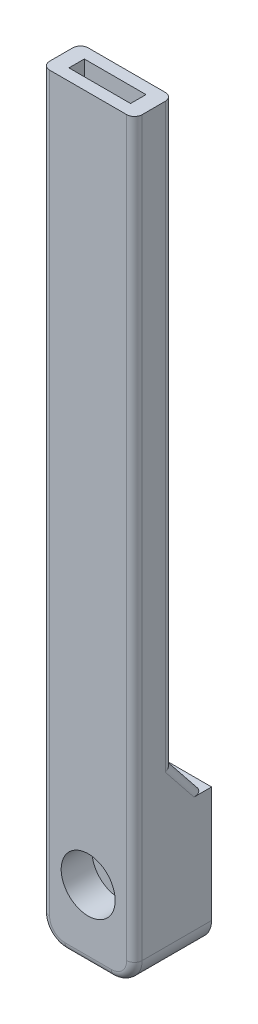
ISO-10303-21;
HEADER;
FILE_DESCRIPTION(('STEP AP214'),'2;1');
FILE_NAME('part.step','',(''),(''),'','','');
FILE_SCHEMA(('AUTOMOTIVE_DESIGN { 1 0 10303 214 1 1 1 1 }'));
ENDSEC;
DATA;
#1=APPLICATION_CONTEXT('core data for automotive mechanical design processes');
#2=APPLICATION_PROTOCOL_DEFINITION('international standard','automotive_design',2000,#1);
#3=PRODUCT_CONTEXT('',#1,'mechanical');
#4=PRODUCT('Part','Part','',(#3));
#5=PRODUCT_RELATED_PRODUCT_CATEGORY('part','',(#4));
#6=PRODUCT_DEFINITION_FORMATION('','',#4);
#7=PRODUCT_DEFINITION_CONTEXT('part definition',#1,'design');
#8=PRODUCT_DEFINITION('design','',#6,#7);
#9=PRODUCT_DEFINITION_SHAPE('','',#8);
#10=(LENGTH_UNIT() NAMED_UNIT(*) SI_UNIT(.MILLI.,.METRE.));
#11=(NAMED_UNIT(*) PLANE_ANGLE_UNIT() SI_UNIT($,.RADIAN.));
#12=(NAMED_UNIT(*) SI_UNIT($,.STERADIAN.) SOLID_ANGLE_UNIT());
#13=UNCERTAINTY_MEASURE_WITH_UNIT(LENGTH_MEASURE(1.E-05),#10,'distance_accuracy_value','');
#14=(GEOMETRIC_REPRESENTATION_CONTEXT(3) GLOBAL_UNCERTAINTY_ASSIGNED_CONTEXT((#13)) GLOBAL_UNIT_ASSIGNED_CONTEXT((#10,
#11,#12)) REPRESENTATION_CONTEXT('',''));
#15=CARTESIAN_POINT('',(0.,0.,0.));
#16=DIRECTION('',(0.,0.,1.));
#17=DIRECTION('',(1.,0.,0.));
#18=AXIS2_PLACEMENT_3D('',#15,#16,#17);
#19=CARTESIAN_POINT('',(0.,0.,23.000000026077));
#20=DIRECTION('',(0.,0.,-1.));
#21=DIRECTION('',(-1.,0.,0.));
#22=AXIS2_PLACEMENT_3D('',#19,#20,#21);
#23=CYLINDRICAL_SURFACE('',#22,2.);
#24=CARTESIAN_POINT('',(0.,0.,3.00000002607703));
#25=DIRECTION('',(0.,0.,-1.));
#26=DIRECTION('',(-1.,0.,0.));
#27=AXIS2_PLACEMENT_3D('',#24,#25,#26);
#28=CIRCLE('',#27,2.);
#29=CARTESIAN_POINT('',(-2.,0.,3.00000002607703));
#30=VERTEX_POINT('',#29);
#31=EDGE_CURVE('E269',#30,#30,#28,.T.);
#32=ORIENTED_EDGE('',*,*,#31,.T.);
#33=EDGE_LOOP('',(#32));
#34=FACE_BOUND('',#33,.T.);
#35=CARTESIAN_POINT('',(0.,0.,9.00000002607703));
#36=DIRECTION('',(0.,0.,1.));
#37=DIRECTION('',(1.,0.,0.));
#38=AXIS2_PLACEMENT_3D('',#35,#36,#37);
#39=CIRCLE('',#38,2.);
#40=CARTESIAN_POINT('',(2.,0.,9.00000002607703));
#41=VERTEX_POINT('',#40);
#42=EDGE_CURVE('E44',#41,#41,#39,.T.);
#43=ORIENTED_EDGE('',*,*,#42,.T.);
#44=EDGE_LOOP('',(#43));
#45=FACE_BOUND('',#44,.T.);
#46=ADVANCED_FACE('F40',(#34,#45),#23,.F.);
#47=CARTESIAN_POINT('',(-6.,9.,13.000000026077));
#48=DIRECTION('',(0.,-1.,0.));
#49=DIRECTION('',(0.,0.,-1.));
#50=AXIS2_PLACEMENT_3D('',#47,#48,#49);
#51=PLANE('',#50);
#52=DIRECTION('',(0.,0.,-1.));
#53=VECTOR('',#52,1.);
#54=CARTESIAN_POINT('',(-6.,9.,13.000000026077));
#55=LINE('',#54,#53);
#56=CARTESIAN_POINT('',(-6.,9.,5.2806248735636));
#57=VERTEX_POINT('',#56);
#58=CARTESIAN_POINT('',(-6.,9.,3.00000002607703));
#59=VERTEX_POINT('',#58);
#60=EDGE_CURVE('E58',#57,#59,#55,.T.);
#61=ORIENTED_EDGE('',*,*,#60,.F.);
#62=CARTESIAN_POINT('',(-5.,9.,5.2806248735636));
#63=DIRECTION('',(0.,-1.,0.));
#64=DIRECTION('',(0.,0.,1.));
#65=AXIS2_PLACEMENT_3D('',#62,#63,#64);
#66=ELLIPSE('',#65,1.28062484748657,1.);
#67=CARTESIAN_POINT('',(-5.,9.,4.00000002607703));
#68=VERTEX_POINT('',#67);
#69=EDGE_CURVE('E50',#57,#68,#66,.T.);
#70=ORIENTED_EDGE('',*,*,#69,.T.);
#71=DIRECTION('',(-1.,0.,0.));
#72=VECTOR('',#71,1.);
#73=CARTESIAN_POINT('',(6.,9.,4.00000002607703));
#74=LINE('',#73,#72);
#75=CARTESIAN_POINT('',(5.,9.,4.00000002607703));
#76=VERTEX_POINT('',#75);
#77=EDGE_CURVE('E366',#76,#68,#74,.T.);
#78=ORIENTED_EDGE('',*,*,#77,.F.);
#79=CARTESIAN_POINT('',(5.,9.,5.2806248735636));
#80=DIRECTION('',(0.,-1.,0.));
#81=DIRECTION('',(0.,0.,1.));
#82=AXIS2_PLACEMENT_3D('',#79,#80,#81);
#83=ELLIPSE('',#82,1.28062484748657,1.);
#84=CARTESIAN_POINT('',(6.,9.,5.2806248735636));
#85=VERTEX_POINT('',#84);
#86=EDGE_CURVE('E295',#76,#85,#83,.T.);
#87=ORIENTED_EDGE('',*,*,#86,.T.);
#88=DIRECTION('',(0.,0.,-1.));
#89=VECTOR('',#88,1.);
#90=CARTESIAN_POINT('',(6.,9.,13.000000026077));
#91=LINE('',#90,#89);
#92=CARTESIAN_POINT('',(6.,9.,3.00000002607703));
#93=VERTEX_POINT('',#92);
#94=EDGE_CURVE('E392',#85,#93,#91,.T.);
#95=ORIENTED_EDGE('',*,*,#94,.T.);
#96=DIRECTION('',(1.,0.,0.));
#97=VECTOR('',#96,1.);
#98=CARTESIAN_POINT('',(0.,9.,3.00000002607703));
#99=LINE('',#98,#97);
#100=EDGE_CURVE('E396',#59,#93,#99,.T.);
#101=ORIENTED_EDGE('',*,*,#100,.F.);
#102=EDGE_LOOP('',(#61,#70,#78,#87,#95,#101));
#103=FACE_BOUND('',#102,.T.);
#104=ADVANCED_FACE('F440',(#103),#51,.F.);
#105=CARTESIAN_POINT('',(-6.,9.,13.000000026077));
#106=DIRECTION('',(1.,0.,0.));
#107=DIRECTION('',(0.,1.,0.));
#108=AXIS2_PLACEMENT_3D('',#105,#106,#107);
#109=PLANE('',#108);
#110=DIRECTION('',(0.,-0.78086880944303,-0.624695047554424));
#111=VECTOR('',#110,1.);
#112=CARTESIAN_POINT('',(-6.,8.37530495244558,4.78086883552006));
#113=LINE('',#112,#111);
#114=CARTESIAN_POINT('',(-6.,13.6492189406418,9.00000002607703));
#115=VERTEX_POINT('',#114);
#116=EDGE_CURVE('E292',#115,#57,#113,.T.);
#117=ORIENTED_EDGE('',*,*,#116,.T.);
#118=ORIENTED_EDGE('',*,*,#60,.T.);
#119=DIRECTION('',(0.,-1.,0.));
#120=VECTOR('',#119,1.);
#121=CARTESIAN_POINT('',(-6.,9.,3.00000002607703));
#122=LINE('',#121,#120);
#123=CARTESIAN_POINT('',(-6.,-6.,3.00000002607703));
#124=VERTEX_POINT('',#123);
#125=EDGE_CURVE('E178',#59,#124,#122,.T.);
#126=ORIENTED_EDGE('',*,*,#125,.T.);
#127=DIRECTION('',(0.,0.,-1.));
#128=VECTOR('',#127,1.);
#129=CARTESIAN_POINT('',(-6.,-6.,13.000000026077));
#130=LINE('',#129,#128);
#131=CARTESIAN_POINT('',(-6.,-6.,12.000000026077));
#132=VERTEX_POINT('',#131);
#133=EDGE_CURVE('E191',#124,#132,#130,.F.);
#134=ORIENTED_EDGE('',*,*,#133,.T.);
#135=DIRECTION('',(0.,-1.,0.));
#136=VECTOR('',#135,1.);
#137=CARTESIAN_POINT('',(-6.00000000000001,89.,12.000000026077));
#138=LINE('',#137,#136);
#139=CARTESIAN_POINT('',(-6.,89.,12.000000026077));
#140=VERTEX_POINT('',#139);
#141=EDGE_CURVE('E253',#132,#140,#138,.F.);
#142=ORIENTED_EDGE('',*,*,#141,.T.);
#143=DIRECTION('',(0.,0.,1.));
#144=VECTOR('',#143,1.);
#145=CARTESIAN_POINT('',(-6.,89.,13.000000026077));
#146=LINE('',#145,#144);
#147=CARTESIAN_POINT('',(-6.,89.,9.00000002607703));
#148=VERTEX_POINT('',#147);
#149=EDGE_CURVE('E370',#148,#140,#146,.T.);
#150=ORIENTED_EDGE('',*,*,#149,.F.);
#151=DIRECTION('',(0.,-1.,0.));
#152=VECTOR('',#151,1.);
#153=CARTESIAN_POINT('',(-6.,9.,9.00000002607703));
#154=LINE('',#153,#152);
#155=EDGE_CURVE('E66',#148,#115,#154,.T.);
#156=ORIENTED_EDGE('',*,*,#155,.T.);
#157=EDGE_LOOP('',(#117,#118,#126,#134,#142,#150,#156));
#158=FACE_BOUND('',#157,.T.);
#159=ADVANCED_FACE('F190',(#158),#109,.F.);
#160=CARTESIAN_POINT('',(-6.,-9.,13.000000026077));
#161=DIRECTION('',(0.,1.,0.));
#162=DIRECTION('',(0.,0.,1.));
#163=AXIS2_PLACEMENT_3D('',#160,#161,#162);
#164=PLANE('',#163);
#165=DIRECTION('',(0.,0.,-1.));
#166=VECTOR('',#165,1.);
#167=CARTESIAN_POINT('',(3.,-9.,13.000000026077));
#168=LINE('',#167,#166);
#169=CARTESIAN_POINT('',(3.,-9.,3.00000002607703));
#170=VERTEX_POINT('',#169);
#171=CARTESIAN_POINT('',(3.,-9.,12.000000026077));
#172=VERTEX_POINT('',#171);
#173=EDGE_CURVE('E200',#170,#172,#168,.F.);
#174=ORIENTED_EDGE('',*,*,#173,.T.);
#175=DIRECTION('',(1.,0.,0.));
#176=VECTOR('',#175,1.);
#177=CARTESIAN_POINT('',(-3.,-9.,12.000000026077));
#178=LINE('',#177,#176);
#179=CARTESIAN_POINT('',(-3.,-9.,12.000000026077));
#180=VERTEX_POINT('',#179);
#181=EDGE_CURVE('E246',#172,#180,#178,.F.);
#182=ORIENTED_EDGE('',*,*,#181,.T.);
#183=DIRECTION('',(0.,0.,-1.));
#184=VECTOR('',#183,1.);
#185=CARTESIAN_POINT('',(-3.,-9.,13.000000026077));
#186=LINE('',#185,#184);
#187=CARTESIAN_POINT('',(-3.,-9.,3.00000002607703));
#188=VERTEX_POINT('',#187);
#189=EDGE_CURVE('E206',#180,#188,#186,.T.);
#190=ORIENTED_EDGE('',*,*,#189,.T.);
#191=DIRECTION('',(1.,0.,0.));
#192=VECTOR('',#191,1.);
#193=CARTESIAN_POINT('',(-6.,-9.,3.00000002607703));
#194=LINE('',#193,#192);
#195=EDGE_CURVE('E180',#188,#170,#194,.T.);
#196=ORIENTED_EDGE('',*,*,#195,.T.);
#197=EDGE_LOOP('',(#174,#182,#190,#196));
#198=FACE_BOUND('',#197,.T.);
#199=ADVANCED_FACE('F407',(#198),#164,.F.);
#200=CARTESIAN_POINT('',(6.,9.,13.000000026077));
#201=DIRECTION('',(-1.,0.,0.));
#202=DIRECTION('',(0.,-1.,0.));
#203=AXIS2_PLACEMENT_3D('',#200,#201,#202);
#204=PLANE('',#203);
#205=ORIENTED_EDGE('',*,*,#94,.F.);
#206=DIRECTION('',(0.,-0.78086880944303,-0.624695047554424));
#207=VECTOR('',#206,1.);
#208=CARTESIAN_POINT('',(6.,14.6253049524456,9.78086883552006));
#209=LINE('',#208,#207);
#210=CARTESIAN_POINT('',(6.,13.6492189406418,9.00000002607703));
#211=VERTEX_POINT('',#210);
#212=EDGE_CURVE('E288',#85,#211,#209,.F.);
#213=ORIENTED_EDGE('',*,*,#212,.T.);
#214=DIRECTION('',(0.,-1.,0.));
#215=VECTOR('',#214,1.);
#216=CARTESIAN_POINT('',(6.,9.,9.00000002607703));
#217=LINE('',#216,#215);
#218=CARTESIAN_POINT('',(6.,89.,9.00000002607703));
#219=VERTEX_POINT('',#218);
#220=EDGE_CURVE('E237',#211,#219,#217,.F.);
#221=ORIENTED_EDGE('',*,*,#220,.T.);
#222=DIRECTION('',(0.,0.,-1.));
#223=VECTOR('',#222,1.);
#224=CARTESIAN_POINT('',(6.,89.,13.000000026077));
#225=LINE('',#224,#223);
#226=CARTESIAN_POINT('',(6.,89.,12.000000026077));
#227=VERTEX_POINT('',#226);
#228=EDGE_CURVE('E381',#227,#219,#225,.T.);
#229=ORIENTED_EDGE('',*,*,#228,.F.);
#230=DIRECTION('',(0.,1.,0.));
#231=VECTOR('',#230,1.);
#232=CARTESIAN_POINT('',(6.,-6.,12.000000026077));
#233=LINE('',#232,#231);
#234=CARTESIAN_POINT('',(6.,-6.,12.000000026077));
#235=VERTEX_POINT('',#234);
#236=EDGE_CURVE('E240',#227,#235,#233,.F.);
#237=ORIENTED_EDGE('',*,*,#236,.T.);
#238=DIRECTION('',(0.,0.,-1.));
#239=VECTOR('',#238,1.);
#240=CARTESIAN_POINT('',(6.,-6.,13.000000026077));
#241=LINE('',#240,#239);
#242=CARTESIAN_POINT('',(6.,-6.,3.00000002607703));
#243=VERTEX_POINT('',#242);
#244=EDGE_CURVE('E402',#235,#243,#241,.T.);
#245=ORIENTED_EDGE('',*,*,#244,.T.);
#246=DIRECTION('',(0.,-1.,0.));
#247=VECTOR('',#246,1.);
#248=CARTESIAN_POINT('',(6.,0.,3.00000002607703));
#249=LINE('',#248,#247);
#250=EDGE_CURVE('E399',#93,#243,#249,.T.);
#251=ORIENTED_EDGE('',*,*,#250,.F.);
#252=EDGE_LOOP('',(#205,#213,#221,#229,#237,#245,#251));
#253=FACE_BOUND('',#252,.T.);
#254=ADVANCED_FACE('F451',(#253),#204,.F.);
#255=CARTESIAN_POINT('',(0.,0.,13.000000026077));
#256=DIRECTION('',(0.,0.,1.));
#257=DIRECTION('',(1.,0.,0.));
#258=AXIS2_PLACEMENT_3D('',#255,#256,#257);
#259=PLANE('',#258);
#260=CARTESIAN_POINT('',(0.,0.,13.000000026077));
#261=DIRECTION('',(0.,0.,1.));
#262=DIRECTION('',(1.,0.,0.));
#263=AXIS2_PLACEMENT_3D('',#260,#261,#262);
#264=CIRCLE('',#263,3.5);
#265=CARTESIAN_POINT('',(3.5,0.,13.000000026077));
#266=VERTEX_POINT('',#265);
#267=EDGE_CURVE('E314',#266,#266,#264,.T.);
#268=ORIENTED_EDGE('',*,*,#267,.F.);
#269=EDGE_LOOP('',(#268));
#270=FACE_BOUND('',#269,.T.);
#271=CARTESIAN_POINT('',(3.,-6.,13.000000026077));
#272=DIRECTION('',(0.,0.,1.));
#273=DIRECTION('',(1.,0.,0.));
#274=AXIS2_PLACEMENT_3D('',#271,#272,#273);
#275=CIRCLE('',#274,2.);
#276=CARTESIAN_POINT('',(3.,-8.,13.000000026077));
#277=VERTEX_POINT('',#276);
#278=CARTESIAN_POINT('',(5.,-6.,13.000000026077));
#279=VERTEX_POINT('',#278);
#280=EDGE_CURVE('E218',#277,#279,#275,.T.);
#281=ORIENTED_EDGE('',*,*,#280,.T.);
#282=DIRECTION('',(0.,1.,0.));
#283=VECTOR('',#282,1.);
#284=CARTESIAN_POINT('',(5.,89.,13.000000026077));
#285=LINE('',#284,#283);
#286=CARTESIAN_POINT('',(5.,89.,13.000000026077));
#287=VERTEX_POINT('',#286);
#288=EDGE_CURVE('E221',#279,#287,#285,.T.);
#289=ORIENTED_EDGE('',*,*,#288,.T.);
#290=DIRECTION('',(1.,0.,0.));
#291=VECTOR('',#290,1.);
#292=CARTESIAN_POINT('',(-6.,89.,13.000000026077));
#293=LINE('',#292,#291);
#294=CARTESIAN_POINT('',(-5.00000000000001,89.,13.000000026077));
#295=VERTEX_POINT('',#294);
#296=EDGE_CURVE('E377',#295,#287,#293,.T.);
#297=ORIENTED_EDGE('',*,*,#296,.F.);
#298=DIRECTION('',(0.,-1.,0.));
#299=VECTOR('',#298,1.);
#300=CARTESIAN_POINT('',(-5.,-6.,13.000000026077));
#301=LINE('',#300,#299);
#302=CARTESIAN_POINT('',(-5.,-6.,13.000000026077));
#303=VERTEX_POINT('',#302);
#304=EDGE_CURVE('E186',#295,#303,#301,.T.);
#305=ORIENTED_EDGE('',*,*,#304,.T.);
#306=CARTESIAN_POINT('',(-3.,-6.,13.000000026077));
#307=DIRECTION('',(0.,0.,1.));
#308=DIRECTION('',(1.,0.,0.));
#309=AXIS2_PLACEMENT_3D('',#306,#307,#308);
#310=CIRCLE('',#309,2.);
#311=CARTESIAN_POINT('',(-3.,-8.,13.000000026077));
#312=VERTEX_POINT('',#311);
#313=EDGE_CURVE('E212',#303,#312,#310,.T.);
#314=ORIENTED_EDGE('',*,*,#313,.T.);
#315=DIRECTION('',(1.,0.,0.));
#316=VECTOR('',#315,1.);
#317=CARTESIAN_POINT('',(3.,-8.,13.000000026077));
#318=LINE('',#317,#316);
#319=EDGE_CURVE('E215',#312,#277,#318,.T.);
#320=ORIENTED_EDGE('',*,*,#319,.T.);
#321=EDGE_LOOP('',(#281,#289,#297,#305,#314,#320));
#322=FACE_BOUND('',#321,.T.);
#323=ADVANCED_FACE('F421',(#270,#322),#259,.T.);
#324=CARTESIAN_POINT('',(-6.,89.,8.00000002607703));
#325=DIRECTION('',(0.,0.,1.));
#326=DIRECTION('',(1.,0.,0.));
#327=AXIS2_PLACEMENT_3D('',#324,#325,#326);
#328=PLANE('',#327);
#329=DIRECTION('',(-1.,0.,0.));
#330=VECTOR('',#329,1.);
#331=CARTESIAN_POINT('',(-6.,89.,8.00000002607703));
#332=LINE('',#331,#330);
#333=CARTESIAN_POINT('',(5.,89.,8.00000002607703));
#334=VERTEX_POINT('',#333);
#335=CARTESIAN_POINT('',(-5.00000000000001,89.,8.00000002607703));
#336=VERTEX_POINT('',#335);
#337=EDGE_CURVE('E194',#334,#336,#332,.T.);
#338=ORIENTED_EDGE('',*,*,#337,.F.);
#339=DIRECTION('',(0.,-1.,0.));
#340=VECTOR('',#339,1.);
#341=CARTESIAN_POINT('',(5.,89.,8.00000002607703));
#342=LINE('',#341,#340);
#343=CARTESIAN_POINT('',(5.,14.,8.00000002607703));
#344=VERTEX_POINT('',#343);
#345=EDGE_CURVE('E259',#334,#344,#342,.T.);
#346=ORIENTED_EDGE('',*,*,#345,.T.);
#347=DIRECTION('',(-1.,0.,0.));
#348=VECTOR('',#347,1.);
#349=CARTESIAN_POINT('',(6.,14.,8.00000002607703));
#350=LINE('',#349,#348);
#351=CARTESIAN_POINT('',(-5.,14.,8.00000002607703));
#352=VERTEX_POINT('',#351);
#353=EDGE_CURVE('E356',#344,#352,#350,.T.);
#354=ORIENTED_EDGE('',*,*,#353,.T.);
#355=DIRECTION('',(0.,-1.,0.));
#356=VECTOR('',#355,1.);
#357=CARTESIAN_POINT('',(-5.00000000000001,89.,8.00000002607703));
#358=LINE('',#357,#356);
#359=EDGE_CURVE('E256',#352,#336,#358,.F.);
#360=ORIENTED_EDGE('',*,*,#359,.T.);
#361=EDGE_LOOP('',(#338,#346,#354,#360));
#362=FACE_BOUND('',#361,.T.);
#363=ADVANCED_FACE('F469',(#362),#328,.F.);
#364=CARTESIAN_POINT('',(0.,89.,0.));
#365=DIRECTION('',(0.,-1.,0.));
#366=DIRECTION('',(0.,0.,-1.));
#367=AXIS2_PLACEMENT_3D('',#364,#365,#366);
#368=PLANE('',#367);
#369=DIRECTION('',(1.,0.,0.));
#370=VECTOR('',#369,1.);
#371=CARTESIAN_POINT('',(-4.,89.,11.500000026077));
#372=LINE('',#371,#370);
#373=CARTESIAN_POINT('',(-4.,89.,11.500000026077));
#374=VERTEX_POINT('',#373);
#375=CARTESIAN_POINT('',(4.,89.,11.500000026077));
#376=VERTEX_POINT('',#375);
#377=EDGE_CURVE('E342',#374,#376,#372,.T.);
#378=ORIENTED_EDGE('',*,*,#377,.F.);
#379=DIRECTION('',(0.,0.,1.));
#380=VECTOR('',#379,1.);
#381=CARTESIAN_POINT('',(-4.,89.,9.50000002607703));
#382=LINE('',#381,#380);
#383=CARTESIAN_POINT('',(-4.,89.,9.50000002607703));
#384=VERTEX_POINT('',#383);
#385=EDGE_CURVE('E281',#384,#374,#382,.T.);
#386=ORIENTED_EDGE('',*,*,#385,.F.);
#387=DIRECTION('',(-1.,0.,0.));
#388=VECTOR('',#387,1.);
#389=CARTESIAN_POINT('',(-4.,89.,9.50000002607703));
#390=LINE('',#389,#388);
#391=CARTESIAN_POINT('',(4.,89.,9.50000002607703));
#392=VERTEX_POINT('',#391);
#393=EDGE_CURVE('E327',#392,#384,#390,.T.);
#394=ORIENTED_EDGE('',*,*,#393,.F.);
#395=DIRECTION('',(0.,0.,-1.));
#396=VECTOR('',#395,1.);
#397=CARTESIAN_POINT('',(4.,89.,9.50000002607703));
#398=LINE('',#397,#396);
#399=EDGE_CURVE('E346',#376,#392,#398,.T.);
#400=ORIENTED_EDGE('',*,*,#399,.F.);
#401=EDGE_LOOP('',(#378,#386,#394,#400));
#402=FACE_BOUND('',#401,.T.);
#403=ORIENTED_EDGE('',*,*,#296,.T.);
#404=CARTESIAN_POINT('',(5.,89.,12.000000026077));
#405=DIRECTION('',(0.,-1.,0.));
#406=DIRECTION('',(0.,0.,-1.));
#407=AXIS2_PLACEMENT_3D('',#404,#405,#406);
#408=CIRCLE('',#407,1.);
#409=EDGE_CURVE('E234',#287,#227,#408,.F.);
#410=ORIENTED_EDGE('',*,*,#409,.T.);
#411=ORIENTED_EDGE('',*,*,#228,.T.);
#412=CARTESIAN_POINT('',(5.,89.,9.00000002607703));
#413=DIRECTION('',(0.,-1.,0.));
#414=DIRECTION('',(0.,0.,-1.));
#415=AXIS2_PLACEMENT_3D('',#412,#413,#414);
#416=CIRCLE('',#415,1.);
#417=EDGE_CURVE('E228',#219,#334,#416,.F.);
#418=ORIENTED_EDGE('',*,*,#417,.T.);
#419=ORIENTED_EDGE('',*,*,#337,.T.);
#420=CARTESIAN_POINT('',(-5.00000000000001,89.,9.00000002607703));
#421=DIRECTION('',(0.,-1.,0.));
#422=DIRECTION('',(0.,0.,-1.));
#423=AXIS2_PLACEMENT_3D('',#420,#421,#422);
#424=CIRCLE('',#423,1.);
#425=EDGE_CURVE('E225',#336,#148,#424,.F.);
#426=ORIENTED_EDGE('',*,*,#425,.T.);
#427=ORIENTED_EDGE('',*,*,#149,.T.);
#428=CARTESIAN_POINT('',(-5.00000000000001,89.,12.000000026077));
#429=DIRECTION('',(0.,-1.,0.));
#430=DIRECTION('',(0.,0.,-1.));
#431=AXIS2_PLACEMENT_3D('',#428,#429,#430);
#432=CIRCLE('',#431,1.);
#433=EDGE_CURVE('E231',#140,#295,#432,.F.);
#434=ORIENTED_EDGE('',*,*,#433,.T.);
#435=EDGE_LOOP('',(#403,#410,#411,#418,#419,#426,#427,#434));
#436=FACE_BOUND('',#435,.T.);
#437=ADVANCED_FACE('F429',(#402,#436),#368,.F.);
#438=CARTESIAN_POINT('',(6.,9.,4.00000002607703));
#439=DIRECTION('',(0.,0.624695047554424,-0.78086880944303));
#440=DIRECTION('',(0.,0.78086880944303,0.624695047554424));
#441=AXIS2_PLACEMENT_3D('',#438,#439,#440);
#442=PLANE('',#441);
#443=ORIENTED_EDGE('',*,*,#353,.F.);
#444=DIRECTION('',(0.,-0.78086880944303,-0.624695047554424));
#445=VECTOR('',#444,1.);
#446=CARTESIAN_POINT('',(5.,9.,4.00000002607703));
#447=LINE('',#446,#445);
#448=EDGE_CURVE('E284',#344,#76,#447,.T.);
#449=ORIENTED_EDGE('',*,*,#448,.T.);
#450=ORIENTED_EDGE('',*,*,#77,.T.);
#451=DIRECTION('',(0.,-0.78086880944303,-0.624695047554424));
#452=VECTOR('',#451,1.);
#453=CARTESIAN_POINT('',(-5.,15.25,9.00000002607703));
#454=LINE('',#453,#452);
#455=EDGE_CURVE('E263',#68,#352,#454,.F.);
#456=ORIENTED_EDGE('',*,*,#455,.T.);
#457=EDGE_LOOP('',(#443,#449,#450,#456));
#458=FACE_BOUND('',#457,.T.);
#459=ADVANCED_FACE('F443',(#458),#442,.T.);
#460=CARTESIAN_POINT('',(3.,-6.,13.000000026077));
#461=DIRECTION('',(0.,0.,-1.));
#462=DIRECTION('',(-1.,0.,0.));
#463=AXIS2_PLACEMENT_3D('',#460,#461,#462);
#464=CYLINDRICAL_SURFACE('',#463,3.);
#465=ORIENTED_EDGE('',*,*,#244,.F.);
#466=CARTESIAN_POINT('',(3.,-6.,12.000000026077));
#467=DIRECTION('',(0.,0.,1.));
#468=DIRECTION('',(1.,0.,0.));
#469=AXIS2_PLACEMENT_3D('',#466,#467,#468);
#470=CIRCLE('',#469,3.);
#471=EDGE_CURVE('E243',#235,#172,#470,.F.);
#472=ORIENTED_EDGE('',*,*,#471,.T.);
#473=ORIENTED_EDGE('',*,*,#173,.F.);
#474=CARTESIAN_POINT('',(3.,-6.,3.00000002607703));
#475=DIRECTION('',(0.,0.,-1.));
#476=DIRECTION('',(-1.,0.,0.));
#477=AXIS2_PLACEMENT_3D('',#474,#475,#476);
#478=CIRCLE('',#477,3.);
#479=EDGE_CURVE('E187',#243,#170,#478,.T.);
#480=ORIENTED_EDGE('',*,*,#479,.F.);
#481=EDGE_LOOP('',(#465,#472,#473,#480));
#482=FACE_BOUND('',#481,.T.);
#483=ADVANCED_FACE('F455',(#482),#464,.T.);
#484=CARTESIAN_POINT('',(-3.,-6.,13.000000026077));
#485=DIRECTION('',(0.,0.,-1.));
#486=DIRECTION('',(-1.,0.,0.));
#487=AXIS2_PLACEMENT_3D('',#484,#485,#486);
#488=CYLINDRICAL_SURFACE('',#487,3.);
#489=ORIENTED_EDGE('',*,*,#189,.F.);
#490=CARTESIAN_POINT('',(-3.,-6.,12.000000026077));
#491=DIRECTION('',(0.,0.,1.));
#492=DIRECTION('',(1.,0.,0.));
#493=AXIS2_PLACEMENT_3D('',#490,#491,#492);
#494=CIRCLE('',#493,3.);
#495=EDGE_CURVE('E198',#180,#132,#494,.F.);
#496=ORIENTED_EDGE('',*,*,#495,.T.);
#497=ORIENTED_EDGE('',*,*,#133,.F.);
#498=CARTESIAN_POINT('',(-3.,-6.,3.00000002607703));
#499=DIRECTION('',(0.,0.,-1.));
#500=DIRECTION('',(-1.,0.,0.));
#501=AXIS2_PLACEMENT_3D('',#498,#499,#500);
#502=CIRCLE('',#501,3.);
#503=EDGE_CURVE('E175',#188,#124,#502,.T.);
#504=ORIENTED_EDGE('',*,*,#503,.F.);
#505=EDGE_LOOP('',(#489,#496,#497,#504));
#506=FACE_BOUND('',#505,.T.);
#507=ADVANCED_FACE('F196',(#506),#488,.T.);
#508=CARTESIAN_POINT('',(-4.,59.,9.50000002607703));
#509=DIRECTION('',(-1.,0.,0.));
#510=DIRECTION('',(0.,0.,1.));
#511=AXIS2_PLACEMENT_3D('',#508,#509,#510);
#512=PLANE('',#511);
#513=ORIENTED_EDGE('',*,*,#385,.T.);
#514=DIRECTION('',(0.,1.,0.));
#515=VECTOR('',#514,1.);
#516=CARTESIAN_POINT('',(-4.,59.,11.500000026077));
#517=LINE('',#516,#515);
#518=CARTESIAN_POINT('',(-4.,59.,11.500000026077));
#519=VERTEX_POINT('',#518);
#520=EDGE_CURVE('E339',#519,#374,#517,.T.);
#521=ORIENTED_EDGE('',*,*,#520,.F.);
#522=DIRECTION('',(0.,0.,1.));
#523=VECTOR('',#522,1.);
#524=CARTESIAN_POINT('',(-4.,59.,9.50000002607703));
#525=LINE('',#524,#523);
#526=CARTESIAN_POINT('',(-4.,59.,9.50000002607703));
#527=VERTEX_POINT('',#526);
#528=EDGE_CURVE('E322',#527,#519,#525,.T.);
#529=ORIENTED_EDGE('',*,*,#528,.F.);
#530=DIRECTION('',(0.,1.,0.));
#531=VECTOR('',#530,1.);
#532=CARTESIAN_POINT('',(-4.,59.,9.50000002607703));
#533=LINE('',#532,#531);
#534=EDGE_CURVE('E353',#527,#384,#533,.T.);
#535=ORIENTED_EDGE('',*,*,#534,.T.);
#536=EDGE_LOOP('',(#513,#521,#529,#535));
#537=FACE_BOUND('',#536,.T.);
#538=ADVANCED_FACE('F501',(#537),#512,.F.);
#539=CARTESIAN_POINT('',(-4.,59.,9.50000002607703));
#540=DIRECTION('',(0.,0.,-1.));
#541=DIRECTION('',(-1.,0.,0.));
#542=AXIS2_PLACEMENT_3D('',#539,#540,#541);
#543=PLANE('',#542);
#544=ORIENTED_EDGE('',*,*,#393,.T.);
#545=ORIENTED_EDGE('',*,*,#534,.F.);
#546=DIRECTION('',(-1.,0.,0.));
#547=VECTOR('',#546,1.);
#548=CARTESIAN_POINT('',(-4.,59.,9.50000002607703));
#549=LINE('',#548,#547);
#550=CARTESIAN_POINT('',(4.,59.,9.50000002607703));
#551=VERTEX_POINT('',#550);
#552=EDGE_CURVE('E335',#551,#527,#549,.T.);
#553=ORIENTED_EDGE('',*,*,#552,.F.);
#554=DIRECTION('',(0.,1.,0.));
#555=VECTOR('',#554,1.);
#556=CARTESIAN_POINT('',(4.,59.,9.50000002607703));
#557=LINE('',#556,#555);
#558=EDGE_CURVE('E357',#551,#392,#557,.T.);
#559=ORIENTED_EDGE('',*,*,#558,.T.);
#560=EDGE_LOOP('',(#544,#545,#553,#559));
#561=FACE_BOUND('',#560,.T.);
#562=ADVANCED_FACE('F497',(#561),#543,.F.);
#563=CARTESIAN_POINT('',(4.,59.,9.50000002607703));
#564=DIRECTION('',(1.,0.,0.));
#565=DIRECTION('',(0.,0.,-1.));
#566=AXIS2_PLACEMENT_3D('',#563,#564,#565);
#567=PLANE('',#566);
#568=ORIENTED_EDGE('',*,*,#399,.T.);
#569=ORIENTED_EDGE('',*,*,#558,.F.);
#570=DIRECTION('',(0.,0.,-1.));
#571=VECTOR('',#570,1.);
#572=CARTESIAN_POINT('',(4.,59.,9.50000002607703));
#573=LINE('',#572,#571);
#574=CARTESIAN_POINT('',(4.,59.,11.500000026077));
#575=VERTEX_POINT('',#574);
#576=EDGE_CURVE('E331',#575,#551,#573,.T.);
#577=ORIENTED_EDGE('',*,*,#576,.F.);
#578=DIRECTION('',(0.,1.,0.));
#579=VECTOR('',#578,1.);
#580=CARTESIAN_POINT('',(4.,59.,11.500000026077));
#581=LINE('',#580,#579);
#582=EDGE_CURVE('E360',#575,#376,#581,.T.);
#583=ORIENTED_EDGE('',*,*,#582,.T.);
#584=EDGE_LOOP('',(#568,#569,#577,#583));
#585=FACE_BOUND('',#584,.T.);
#586=ADVANCED_FACE('F500',(#585),#567,.F.);
#587=CARTESIAN_POINT('',(-4.,59.,11.500000026077));
#588=DIRECTION('',(0.,0.,1.));
#589=DIRECTION('',(1.,0.,0.));
#590=AXIS2_PLACEMENT_3D('',#587,#588,#589);
#591=PLANE('',#590);
#592=ORIENTED_EDGE('',*,*,#377,.T.);
#593=ORIENTED_EDGE('',*,*,#582,.F.);
#594=DIRECTION('',(1.,0.,0.));
#595=VECTOR('',#594,1.);
#596=CARTESIAN_POINT('',(-4.,59.,11.500000026077));
#597=LINE('',#596,#595);
#598=EDGE_CURVE('E326',#519,#575,#597,.T.);
#599=ORIENTED_EDGE('',*,*,#598,.F.);
#600=ORIENTED_EDGE('',*,*,#520,.T.);
#601=EDGE_LOOP('',(#592,#593,#599,#600));
#602=FACE_BOUND('',#601,.T.);
#603=ADVANCED_FACE('F495',(#602),#591,.F.);
#604=CARTESIAN_POINT('',(0.,59.,0.));
#605=DIRECTION('',(0.,1.,0.));
#606=DIRECTION('',(0.,0.,1.));
#607=AXIS2_PLACEMENT_3D('',#604,#605,#606);
#608=PLANE('',#607);
#609=ORIENTED_EDGE('',*,*,#528,.T.);
#610=ORIENTED_EDGE('',*,*,#598,.T.);
#611=ORIENTED_EDGE('',*,*,#576,.T.);
#612=ORIENTED_EDGE('',*,*,#552,.T.);
#613=EDGE_LOOP('',(#609,#610,#611,#612));
#614=FACE_BOUND('',#613,.T.);
#615=ADVANCED_FACE('F492',(#614),#608,.T.);
#616=CARTESIAN_POINT('',(-5.,0.,12.000000026077));
#617=DIRECTION('',(0.,1.,0.));
#618=DIRECTION('',(-1.,0.,0.));
#619=AXIS2_PLACEMENT_3D('',#616,#617,#618);
#620=CYLINDRICAL_SURFACE('',#619,1.);
#621=ORIENTED_EDGE('',*,*,#433,.F.);
#622=ORIENTED_EDGE('',*,*,#141,.F.);
#623=CARTESIAN_POINT('',(-5.,-6.,12.000000026077));
#624=DIRECTION('',(0.,-1.,0.));
#625=DIRECTION('',(0.,0.,-1.));
#626=AXIS2_PLACEMENT_3D('',#623,#624,#625);
#627=CIRCLE('',#626,1.);
#628=EDGE_CURVE('E277',#303,#132,#627,.T.);
#629=ORIENTED_EDGE('',*,*,#628,.F.);
#630=ORIENTED_EDGE('',*,*,#304,.F.);
#631=EDGE_LOOP('',(#621,#622,#629,#630));
#632=FACE_BOUND('',#631,.T.);
#633=ADVANCED_FACE('F427',(#632),#620,.T.);
#634=CARTESIAN_POINT('',(-3.,-6.,12.000000026077));
#635=DIRECTION('',(0.,0.,1.));
#636=DIRECTION('',(1.,0.,0.));
#637=AXIS2_PLACEMENT_3D('',#634,#635,#636);
#638=TOROIDAL_SURFACE('',#637,2.,1.);
#639=ORIENTED_EDGE('',*,*,#628,.T.);
#640=ORIENTED_EDGE('',*,*,#495,.F.);
#641=CARTESIAN_POINT('',(-3.,-8.,12.000000026077));
#642=DIRECTION('',(1.,0.,0.));
#643=DIRECTION('',(0.,0.,-1.));
#644=AXIS2_PLACEMENT_3D('',#641,#642,#643);
#645=CIRCLE('',#644,1.);
#646=EDGE_CURVE('E273',#312,#180,#645,.T.);
#647=ORIENTED_EDGE('',*,*,#646,.F.);
#648=ORIENTED_EDGE('',*,*,#313,.F.);
#649=EDGE_LOOP('',(#639,#640,#647,#648));
#650=FACE_BOUND('',#649,.T.);
#651=ADVANCED_FACE('F412',(#650),#638,.T.);
#652=CARTESIAN_POINT('',(0.,-8.,12.000000026077));
#653=DIRECTION('',(-1.,0.,0.));
#654=DIRECTION('',(0.,0.,1.));
#655=AXIS2_PLACEMENT_3D('',#652,#653,#654);
#656=CYLINDRICAL_SURFACE('',#655,1.);
#657=ORIENTED_EDGE('',*,*,#646,.T.);
#658=ORIENTED_EDGE('',*,*,#181,.F.);
#659=CARTESIAN_POINT('',(3.,-8.,12.000000026077));
#660=DIRECTION('',(1.,0.,0.));
#661=DIRECTION('',(0.,1.,0.));
#662=AXIS2_PLACEMENT_3D('',#659,#660,#661);
#663=CIRCLE('',#662,1.);
#664=EDGE_CURVE('E268',#277,#172,#663,.T.);
#665=ORIENTED_EDGE('',*,*,#664,.F.);
#666=ORIENTED_EDGE('',*,*,#319,.F.);
#667=EDGE_LOOP('',(#657,#658,#665,#666));
#668=FACE_BOUND('',#667,.T.);
#669=ADVANCED_FACE('F417',(#668),#656,.T.);
#670=CARTESIAN_POINT('',(3.,-6.,12.000000026077));
#671=DIRECTION('',(0.,0.,1.));
#672=DIRECTION('',(1.,0.,0.));
#673=AXIS2_PLACEMENT_3D('',#670,#671,#672);
#674=TOROIDAL_SURFACE('',#673,2.,1.);
#675=ORIENTED_EDGE('',*,*,#664,.T.);
#676=ORIENTED_EDGE('',*,*,#471,.F.);
#677=CARTESIAN_POINT('',(5.,-6.,12.000000026077));
#678=DIRECTION('',(0.,1.,0.));
#679=DIRECTION('',(0.,0.,1.));
#680=AXIS2_PLACEMENT_3D('',#677,#678,#679);
#681=CIRCLE('',#680,1.);
#682=EDGE_CURVE('E264',#279,#235,#681,.T.);
#683=ORIENTED_EDGE('',*,*,#682,.F.);
#684=ORIENTED_EDGE('',*,*,#280,.F.);
#685=EDGE_LOOP('',(#675,#676,#683,#684));
#686=FACE_BOUND('',#685,.T.);
#687=ADVANCED_FACE('F458',(#686),#674,.T.);
#688=CARTESIAN_POINT('',(5.,0.,12.000000026077));
#689=DIRECTION('',(0.,-1.,0.));
#690=DIRECTION('',(1.,0.,0.));
#691=AXIS2_PLACEMENT_3D('',#688,#689,#690);
#692=CYLINDRICAL_SURFACE('',#691,1.);
#693=ORIENTED_EDGE('',*,*,#682,.T.);
#694=ORIENTED_EDGE('',*,*,#236,.F.);
#695=ORIENTED_EDGE('',*,*,#409,.F.);
#696=ORIENTED_EDGE('',*,*,#288,.F.);
#697=EDGE_LOOP('',(#693,#694,#695,#696));
#698=FACE_BOUND('',#697,.T.);
#699=ADVANCED_FACE('F462',(#698),#692,.T.);
#700=CARTESIAN_POINT('',(5.,89.,9.00000002607703));
#701=DIRECTION('',(0.,-1.,0.));
#702=DIRECTION('',(1.,0.,0.));
#703=AXIS2_PLACEMENT_3D('',#700,#701,#702);
#704=CYLINDRICAL_SURFACE('',#703,1.);
#705=ORIENTED_EDGE('',*,*,#417,.F.);
#706=ORIENTED_EDGE('',*,*,#220,.F.);
#707=CARTESIAN_POINT('',(5.,13.6492189406418,9.00000002607703));
#708=DIRECTION('',(0.,0.943628319160418,0.3310069414355));
#709=DIRECTION('',(0.,-0.3310069414355,0.943628319160418));
#710=AXIS2_PLACEMENT_3D('',#707,#708,#709);
#711=ELLIPSE('',#710,1.05973928473208,1.);
#712=EDGE_CURVE('E299',#211,#344,#711,.T.);
#713=ORIENTED_EDGE('',*,*,#712,.T.);
#714=ORIENTED_EDGE('',*,*,#345,.F.);
#715=EDGE_LOOP('',(#705,#706,#713,#714));
#716=FACE_BOUND('',#715,.T.);
#717=ADVANCED_FACE('F466',(#716),#704,.T.);
#718=CARTESIAN_POINT('',(-5.,9.,9.00000002607703));
#719=DIRECTION('',(0.,-1.,0.));
#720=DIRECTION('',(1.,0.,0.));
#721=AXIS2_PLACEMENT_3D('',#718,#719,#720);
#722=CYLINDRICAL_SURFACE('',#721,1.);
#723=ORIENTED_EDGE('',*,*,#425,.F.);
#724=ORIENTED_EDGE('',*,*,#359,.F.);
#725=CARTESIAN_POINT('',(-5.,13.6492189406418,9.00000002607703));
#726=DIRECTION('',(0.,0.943628319160418,0.3310069414355));
#727=DIRECTION('',(0.,-0.3310069414355,0.943628319160418));
#728=AXIS2_PLACEMENT_3D('',#725,#726,#727);
#729=ELLIPSE('',#728,1.05973928473208,1.);
#730=EDGE_CURVE('E11',#352,#115,#729,.T.);
#731=ORIENTED_EDGE('',*,*,#730,.T.);
#732=ORIENTED_EDGE('',*,*,#155,.F.);
#733=EDGE_LOOP('',(#723,#724,#731,#732));
#734=FACE_BOUND('',#733,.T.);
#735=ADVANCED_FACE('F434',(#734),#722,.T.);
#736=CARTESIAN_POINT('',(5.,8.37530495244558,4.78086883552006));
#737=DIRECTION('',(0.,0.78086880944303,0.624695047554424));
#738=DIRECTION('',(0.,-0.624695047554424,0.78086880944303));
#739=AXIS2_PLACEMENT_3D('',#736,#737,#738);
#740=CYLINDRICAL_SURFACE('',#739,1.);
#741=ORIENTED_EDGE('',*,*,#712,.F.);
#742=ORIENTED_EDGE('',*,*,#212,.F.);
#743=ORIENTED_EDGE('',*,*,#86,.F.);
#744=ORIENTED_EDGE('',*,*,#448,.F.);
#745=EDGE_LOOP('',(#741,#742,#743,#744));
#746=FACE_BOUND('',#745,.T.);
#747=ADVANCED_FACE('F447',(#746),#740,.T.);
#748=CARTESIAN_POINT('',(-5.,12.7655488548846,8.29306395747128));
#749=DIRECTION('',(0.,0.78086880944303,0.624695047554424));
#750=DIRECTION('',(0.,-0.624695047554424,0.78086880944303));
#751=AXIS2_PLACEMENT_3D('',#748,#749,#750);
#752=CYLINDRICAL_SURFACE('',#751,1.);
#753=ORIENTED_EDGE('',*,*,#730,.F.);
#754=ORIENTED_EDGE('',*,*,#455,.F.);
#755=ORIENTED_EDGE('',*,*,#69,.F.);
#756=ORIENTED_EDGE('',*,*,#116,.F.);
#757=EDGE_LOOP('',(#753,#754,#755,#756));
#758=FACE_BOUND('',#757,.T.);
#759=ADVANCED_FACE('F42',(#758),#752,.T.);
#760=CARTESIAN_POINT('',(0.,0.,3.00000002607703));
#761=DIRECTION('',(0.,0.,-1.));
#762=DIRECTION('',(-1.,0.,0.));
#763=AXIS2_PLACEMENT_3D('',#760,#761,#762);
#764=PLANE('',#763);
#765=ORIENTED_EDGE('',*,*,#31,.F.);
#766=EDGE_LOOP('',(#765));
#767=FACE_BOUND('',#766,.T.);
#768=ORIENTED_EDGE('',*,*,#100,.T.);
#769=ORIENTED_EDGE('',*,*,#250,.T.);
#770=ORIENTED_EDGE('',*,*,#479,.T.);
#771=ORIENTED_EDGE('',*,*,#195,.F.);
#772=ORIENTED_EDGE('',*,*,#503,.T.);
#773=ORIENTED_EDGE('',*,*,#125,.F.);
#774=EDGE_LOOP('',(#768,#769,#770,#771,#772,#773));
#775=FACE_BOUND('',#774,.T.);
#776=ADVANCED_FACE('F177',(#767,#775),#764,.T.);
#777=CARTESIAN_POINT('',(0.,0.,9.00000002607703));
#778=DIRECTION('',(0.,0.,1.));
#779=DIRECTION('',(1.,0.,0.));
#780=AXIS2_PLACEMENT_3D('',#777,#778,#779);
#781=CYLINDRICAL_SURFACE('',#780,3.5);
#782=CARTESIAN_POINT('',(0.,0.,9.00000002607703));
#783=DIRECTION('',(0.,0.,1.));
#784=DIRECTION('',(1.,0.,0.));
#785=AXIS2_PLACEMENT_3D('',#782,#783,#784);
#786=CIRCLE('',#785,3.5);
#787=CARTESIAN_POINT('',(3.5,0.,9.00000002607703));
#788=VERTEX_POINT('',#787);
#789=EDGE_CURVE('E309',#788,#788,#786,.T.);
#790=ORIENTED_EDGE('',*,*,#789,.F.);
#791=EDGE_LOOP('',(#790));
#792=FACE_BOUND('',#791,.T.);
#793=ORIENTED_EDGE('',*,*,#267,.T.);
#794=EDGE_LOOP('',(#793));
#795=FACE_BOUND('',#794,.T.);
#796=ADVANCED_FACE('F544',(#792,#795),#781,.F.);
#797=CARTESIAN_POINT('',(0.,0.,9.00000002607703));
#798=DIRECTION('',(0.,0.,1.));
#799=DIRECTION('',(1.,0.,0.));
#800=AXIS2_PLACEMENT_3D('',#797,#798,#799);
#801=PLANE('',#800);
#802=ORIENTED_EDGE('',*,*,#42,.F.);
#803=EDGE_LOOP('',(#802));
#804=FACE_BOUND('',#803,.T.);
#805=ORIENTED_EDGE('',*,*,#789,.T.);
#806=EDGE_LOOP('',(#805));
#807=FACE_BOUND('',#806,.T.);
#808=ADVANCED_FACE('F549',(#804,#807),#801,.T.);
#809=CLOSED_SHELL('',(#46,#104,#159,#199,#254,#323,#363,#437,#459,#483,#507,#538,#562,#586,#603,
#615,#633,#651,#669,#687,#699,#717,#735,#747,#759,#776,#796,#808));
#810=MANIFOLD_SOLID_BREP('B2',#809);
#811=ADVANCED_BREP_SHAPE_REPRESENTATION('',(#18,#810),#14);
#812=SHAPE_DEFINITION_REPRESENTATION(#9,#811);
ENDSEC;
END-ISO-10303-21;
